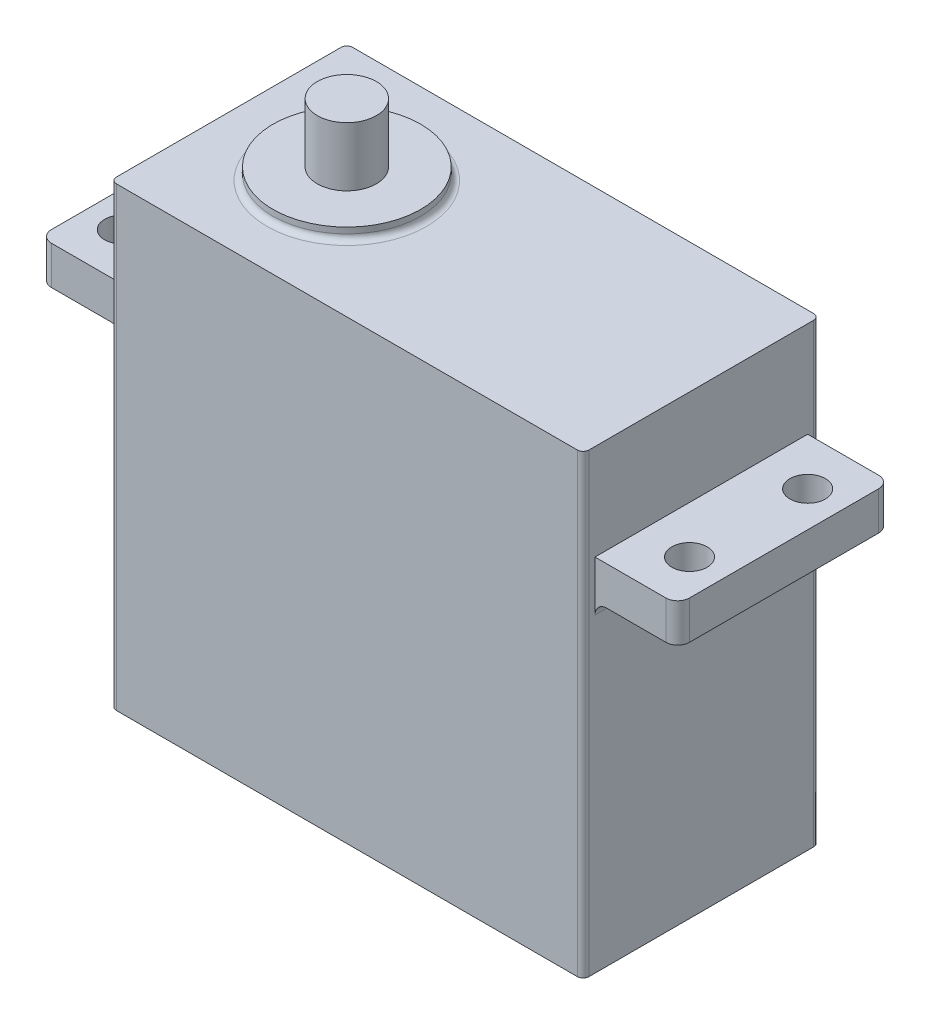
ISO-10303-21;
HEADER;
FILE_DESCRIPTION(('STEP AP214'),'2;1');
FILE_NAME('part.step','',(''),(''),'','','');
FILE_SCHEMA(('AUTOMOTIVE_DESIGN { 1 0 10303 214 1 1 1 1 }'));
ENDSEC;
DATA;
#1=APPLICATION_CONTEXT('core data for automotive mechanical design processes');
#2=APPLICATION_PROTOCOL_DEFINITION('international standard','automotive_design',2000,#1);
#3=PRODUCT_CONTEXT('',#1,'mechanical');
#4=PRODUCT('Part','Part','',(#3));
#5=PRODUCT_RELATED_PRODUCT_CATEGORY('part','',(#4));
#6=PRODUCT_DEFINITION_FORMATION('','',#4);
#7=PRODUCT_DEFINITION_CONTEXT('part definition',#1,'design');
#8=PRODUCT_DEFINITION('design','',#6,#7);
#9=PRODUCT_DEFINITION_SHAPE('','',#8);
#10=(LENGTH_UNIT() NAMED_UNIT(*) SI_UNIT(.MILLI.,.METRE.));
#11=(NAMED_UNIT(*) PLANE_ANGLE_UNIT() SI_UNIT($,.RADIAN.));
#12=(NAMED_UNIT(*) SI_UNIT($,.STERADIAN.) SOLID_ANGLE_UNIT());
#13=UNCERTAINTY_MEASURE_WITH_UNIT(LENGTH_MEASURE(1.E-05),#10,'distance_accuracy_value','');
#14=(GEOMETRIC_REPRESENTATION_CONTEXT(3) GLOBAL_UNCERTAINTY_ASSIGNED_CONTEXT((#13)) GLOBAL_UNIT_ASSIGNED_CONTEXT((#10,
#11,#12)) REPRESENTATION_CONTEXT('',''));
#15=CARTESIAN_POINT('',(0.,0.,0.));
#16=DIRECTION('',(0.,0.,1.));
#17=DIRECTION('',(1.,0.,0.));
#18=AXIS2_PLACEMENT_3D('',#15,#16,#17);
#19=CARTESIAN_POINT('',(-10.,44.6,0.));
#20=DIRECTION('',(0.,1.,0.));
#21=DIRECTION('',(0.,0.,1.));
#22=AXIS2_PLACEMENT_3D('',#19,#20,#21);
#23=PLANE('',#22);
#24=CARTESIAN_POINT('',(-10.,44.6,0.));
#25=DIRECTION('',(0.,-1.,0.));
#26=DIRECTION('',(0.,0.,-1.));
#27=AXIS2_PLACEMENT_3D('',#24,#25,#26);
#28=CIRCLE('',#27,2.5);
#29=CARTESIAN_POINT('',(-10.,44.6,-2.5));
#30=VERTEX_POINT('',#29);
#31=EDGE_CURVE('E193',#30,#30,#28,.T.);
#32=ORIENTED_EDGE('',*,*,#31,.F.);
#33=EDGE_LOOP('',(#32));
#34=FACE_BOUND('',#33,.T.);
#35=ADVANCED_FACE('F17',(#34),#23,.T.);
#36=CARTESIAN_POINT('',(-10.,44.6,0.));
#37=DIRECTION('',(0.,-1.,0.));
#38=DIRECTION('',(0.,0.,-1.));
#39=AXIS2_PLACEMENT_3D('',#36,#37,#38);
#40=CYLINDRICAL_SURFACE('',#39,2.5);
#41=CARTESIAN_POINT('',(-10.,39.6,0.));
#42=DIRECTION('',(0.,-1.,0.));
#43=DIRECTION('',(0.,0.,-1.));
#44=AXIS2_PLACEMENT_3D('',#41,#42,#43);
#45=CIRCLE('',#44,2.5);
#46=CARTESIAN_POINT('',(-10.,39.6,-2.5));
#47=VERTEX_POINT('',#46);
#48=EDGE_CURVE('E176',#47,#47,#45,.T.);
#49=ORIENTED_EDGE('',*,*,#48,.F.);
#50=EDGE_LOOP('',(#49));
#51=FACE_BOUND('',#50,.T.);
#52=ORIENTED_EDGE('',*,*,#31,.T.);
#53=EDGE_LOOP('',(#52));
#54=FACE_BOUND('',#53,.T.);
#55=ADVANCED_FACE('F600',(#51,#54),#40,.T.);
#56=CARTESIAN_POINT('',(-10.,39.6,0.));
#57=DIRECTION('',(0.,1.,0.));
#58=DIRECTION('',(0.,0.,1.));
#59=AXIS2_PLACEMENT_3D('',#56,#57,#58);
#60=PLANE('',#59);
#61=CARTESIAN_POINT('',(-10.,39.6,0.));
#62=DIRECTION('',(0.,-1.,0.));
#63=DIRECTION('',(0.,0.,-1.));
#64=AXIS2_PLACEMENT_3D('',#61,#62,#63);
#65=CIRCLE('',#64,6.25);
#66=CARTESIAN_POINT('',(-10.,39.6,-6.25));
#67=VERTEX_POINT('',#66);
#68=EDGE_CURVE('E276',#67,#67,#65,.T.);
#69=ORIENTED_EDGE('',*,*,#68,.F.);
#70=EDGE_LOOP('',(#69));
#71=FACE_BOUND('',#70,.T.);
#72=ORIENTED_EDGE('',*,*,#48,.T.);
#73=EDGE_LOOP('',(#72));
#74=FACE_BOUND('',#73,.T.);
#75=ADVANCED_FACE('F597',(#71,#74),#60,.T.);
#76=CARTESIAN_POINT('',(24.,30.5,5.));
#77=DIRECTION('',(0.,-1.,0.));
#78=DIRECTION('',(0.,0.,-1.));
#79=AXIS2_PLACEMENT_3D('',#76,#77,#78);
#80=CYLINDRICAL_SURFACE('',#79,1.5);
#81=CARTESIAN_POINT('',(24.,27.25,5.));
#82=DIRECTION('',(0.,-1.,0.));
#83=DIRECTION('',(0.,0.,-1.));
#84=AXIS2_PLACEMENT_3D('',#81,#82,#83);
#85=CIRCLE('',#84,1.5);
#86=CARTESIAN_POINT('',(24.,27.25,3.5));
#87=VERTEX_POINT('',#86);
#88=EDGE_CURVE('E167',#87,#87,#85,.F.);
#89=ORIENTED_EDGE('',*,*,#88,.F.);
#90=EDGE_LOOP('',(#89));
#91=FACE_BOUND('',#90,.T.);
#92=CARTESIAN_POINT('',(24.,30.5,5.));
#93=DIRECTION('',(0.,-1.,0.));
#94=DIRECTION('',(0.,0.,-1.));
#95=AXIS2_PLACEMENT_3D('',#92,#93,#94);
#96=CIRCLE('',#95,1.5);
#97=CARTESIAN_POINT('',(24.,30.5,3.5));
#98=VERTEX_POINT('',#97);
#99=EDGE_CURVE('E273',#98,#98,#96,.F.);
#100=ORIENTED_EDGE('',*,*,#99,.T.);
#101=EDGE_LOOP('',(#100));
#102=FACE_BOUND('',#101,.T.);
#103=ADVANCED_FACE('F593',(#91,#102),#80,.F.);
#104=CARTESIAN_POINT('',(24.,30.5,-5.));
#105=DIRECTION('',(0.,-1.,0.));
#106=DIRECTION('',(0.,0.,-1.));
#107=AXIS2_PLACEMENT_3D('',#104,#105,#106);
#108=CYLINDRICAL_SURFACE('',#107,1.5);
#109=CARTESIAN_POINT('',(24.,27.25,-5.));
#110=DIRECTION('',(0.,-1.,0.));
#111=DIRECTION('',(0.,0.,-1.));
#112=AXIS2_PLACEMENT_3D('',#109,#110,#111);
#113=CIRCLE('',#112,1.5);
#114=CARTESIAN_POINT('',(24.,27.25,-6.5));
#115=VERTEX_POINT('',#114);
#116=EDGE_CURVE('E182',#115,#115,#113,.F.);
#117=ORIENTED_EDGE('',*,*,#116,.F.);
#118=EDGE_LOOP('',(#117));
#119=FACE_BOUND('',#118,.T.);
#120=CARTESIAN_POINT('',(24.,30.5,-5.));
#121=DIRECTION('',(0.,-1.,0.));
#122=DIRECTION('',(0.,0.,-1.));
#123=AXIS2_PLACEMENT_3D('',#120,#121,#122);
#124=CIRCLE('',#123,1.5);
#125=CARTESIAN_POINT('',(24.,30.5,-6.5));
#126=VERTEX_POINT('',#125);
#127=EDGE_CURVE('E270',#126,#126,#124,.F.);
#128=ORIENTED_EDGE('',*,*,#127,.T.);
#129=EDGE_LOOP('',(#128));
#130=FACE_BOUND('',#129,.T.);
#131=ADVANCED_FACE('F590',(#119,#130),#108,.F.);
#132=CARTESIAN_POINT('',(27.,30.5,9.));
#133=DIRECTION('',(-1.,0.,0.));
#134=DIRECTION('',(0.,0.,1.));
#135=AXIS2_PLACEMENT_3D('',#132,#133,#134);
#136=PLANE('',#135);
#137=DIRECTION('',(0.,-1.,0.));
#138=VECTOR('',#137,1.);
#139=CARTESIAN_POINT('',(27.,30.5,-8.));
#140=LINE('',#139,#138);
#141=CARTESIAN_POINT('',(27.,30.5,-8.));
#142=VERTEX_POINT('',#141);
#143=CARTESIAN_POINT('',(27.,27.25,-8.));
#144=VERTEX_POINT('',#143);
#145=EDGE_CURVE('E185',#142,#144,#140,.T.);
#146=ORIENTED_EDGE('',*,*,#145,.F.);
#147=DIRECTION('',(0.,0.,-1.));
#148=VECTOR('',#147,1.);
#149=CARTESIAN_POINT('',(27.,30.5,0.));
#150=LINE('',#149,#148);
#151=CARTESIAN_POINT('',(27.,30.5,8.));
#152=VERTEX_POINT('',#151);
#153=EDGE_CURVE('E173',#142,#152,#150,.F.);
#154=ORIENTED_EDGE('',*,*,#153,.T.);
#155=DIRECTION('',(0.,-1.,0.));
#156=VECTOR('',#155,1.);
#157=CARTESIAN_POINT('',(27.,30.5,8.));
#158=LINE('',#157,#156);
#159=CARTESIAN_POINT('',(27.,27.25,8.));
#160=VERTEX_POINT('',#159);
#161=EDGE_CURVE('E170',#160,#152,#158,.F.);
#162=ORIENTED_EDGE('',*,*,#161,.F.);
#163=DIRECTION('',(0.,0.,-1.));
#164=VECTOR('',#163,1.);
#165=CARTESIAN_POINT('',(27.,27.25,0.));
#166=LINE('',#165,#164);
#167=EDGE_CURVE('E156',#144,#160,#166,.F.);
#168=ORIENTED_EDGE('',*,*,#167,.F.);
#169=EDGE_LOOP('',(#146,#154,#162,#168));
#170=FACE_BOUND('',#169,.T.);
#171=ADVANCED_FACE('F171',(#170),#136,.F.);
#172=CARTESIAN_POINT('',(26.,30.5,8.));
#173=DIRECTION('',(0.,-1.,0.));
#174=DIRECTION('',(0.,0.,-1.));
#175=AXIS2_PLACEMENT_3D('',#172,#173,#174);
#176=CYLINDRICAL_SURFACE('',#175,1.);
#177=CARTESIAN_POINT('',(26.,27.25,8.));
#178=DIRECTION('',(0.,-1.,0.));
#179=DIRECTION('',(0.,0.,-1.));
#180=AXIS2_PLACEMENT_3D('',#177,#178,#179);
#181=CIRCLE('',#180,1.);
#182=CARTESIAN_POINT('',(26.,27.25,9.));
#183=VERTEX_POINT('',#182);
#184=EDGE_CURVE('E162',#160,#183,#181,.T.);
#185=ORIENTED_EDGE('',*,*,#184,.F.);
#186=ORIENTED_EDGE('',*,*,#161,.T.);
#187=CARTESIAN_POINT('',(26.,30.5,8.));
#188=DIRECTION('',(0.,-1.,0.));
#189=DIRECTION('',(0.,0.,-1.));
#190=AXIS2_PLACEMENT_3D('',#187,#188,#189);
#191=CIRCLE('',#190,1.);
#192=CARTESIAN_POINT('',(26.,30.5,9.));
#193=VERTEX_POINT('',#192);
#194=EDGE_CURVE('E268',#152,#193,#191,.T.);
#195=ORIENTED_EDGE('',*,*,#194,.T.);
#196=DIRECTION('',(0.,1.,0.));
#197=VECTOR('',#196,1.);
#198=CARTESIAN_POINT('',(26.,30.5,9.));
#199=LINE('',#198,#197);
#200=EDGE_CURVE('E181',#193,#183,#199,.F.);
#201=ORIENTED_EDGE('',*,*,#200,.T.);
#202=EDGE_LOOP('',(#185,#186,#195,#201));
#203=FACE_BOUND('',#202,.T.);
#204=ADVANCED_FACE('F179',(#203),#176,.T.);
#205=CARTESIAN_POINT('',(0.,27.25,0.));
#206=DIRECTION('',(0.,-1.,0.));
#207=DIRECTION('',(0.,0.,-1.));
#208=AXIS2_PLACEMENT_3D('',#205,#206,#207);
#209=PLANE('',#208);
#210=ORIENTED_EDGE('',*,*,#116,.T.);
#211=EDGE_LOOP('',(#210));
#212=FACE_BOUND('',#211,.T.);
#213=DIRECTION('',(-1.,0.,0.));
#214=VECTOR('',#213,1.);
#215=CARTESIAN_POINT('',(27.,27.25,9.));
#216=LINE('',#215,#214);
#217=CARTESIAN_POINT('',(21.,27.25,9.));
#218=VERTEX_POINT('',#217);
#219=EDGE_CURVE('E418',#183,#218,#216,.T.);
#220=ORIENTED_EDGE('',*,*,#219,.T.);
#221=DIRECTION('',(0.,0.,-1.));
#222=VECTOR('',#221,1.);
#223=CARTESIAN_POINT('',(21.,27.25,0.));
#224=LINE('',#223,#222);
#225=CARTESIAN_POINT('',(21.,27.25,-9.));
#226=VERTEX_POINT('',#225);
#227=EDGE_CURVE('E264',#218,#226,#224,.T.);
#228=ORIENTED_EDGE('',*,*,#227,.T.);
#229=DIRECTION('',(1.,0.,0.));
#230=VECTOR('',#229,1.);
#231=CARTESIAN_POINT('',(27.,27.25,-9.));
#232=LINE('',#231,#230);
#233=CARTESIAN_POINT('',(26.,27.25,-9.));
#234=VERTEX_POINT('',#233);
#235=EDGE_CURVE('E260',#226,#234,#232,.T.);
#236=ORIENTED_EDGE('',*,*,#235,.T.);
#237=CARTESIAN_POINT('',(26.,27.25,-8.));
#238=DIRECTION('',(0.,-1.,0.));
#239=DIRECTION('',(0.,0.,-1.));
#240=AXIS2_PLACEMENT_3D('',#237,#238,#239);
#241=CIRCLE('',#240,1.);
#242=EDGE_CURVE('E165',#144,#234,#241,.F.);
#243=ORIENTED_EDGE('',*,*,#242,.F.);
#244=ORIENTED_EDGE('',*,*,#167,.T.);
#245=ORIENTED_EDGE('',*,*,#184,.T.);
#246=EDGE_LOOP('',(#220,#228,#236,#243,#244,#245));
#247=FACE_BOUND('',#246,.T.);
#248=ORIENTED_EDGE('',*,*,#88,.T.);
#249=EDGE_LOOP('',(#248));
#250=FACE_BOUND('',#249,.T.);
#251=ADVANCED_FACE('F159',(#212,#247,#250),#209,.T.);
#252=CARTESIAN_POINT('',(26.,30.5,-8.));
#253=DIRECTION('',(0.,-1.,0.));
#254=DIRECTION('',(0.,0.,-1.));
#255=AXIS2_PLACEMENT_3D('',#252,#253,#254);
#256=CYLINDRICAL_SURFACE('',#255,1.);
#257=ORIENTED_EDGE('',*,*,#242,.T.);
#258=DIRECTION('',(0.,1.,0.));
#259=VECTOR('',#258,1.);
#260=CARTESIAN_POINT('',(26.,30.5,-9.));
#261=LINE('',#260,#259);
#262=CARTESIAN_POINT('',(26.,30.5,-9.));
#263=VERTEX_POINT('',#262);
#264=EDGE_CURVE('E396',#234,#263,#261,.T.);
#265=ORIENTED_EDGE('',*,*,#264,.T.);
#266=CARTESIAN_POINT('',(26.,30.5,-8.));
#267=DIRECTION('',(0.,-1.,0.));
#268=DIRECTION('',(0.,0.,-1.));
#269=AXIS2_PLACEMENT_3D('',#266,#267,#268);
#270=CIRCLE('',#269,1.);
#271=EDGE_CURVE('E265',#263,#142,#270,.T.);
#272=ORIENTED_EDGE('',*,*,#271,.T.);
#273=ORIENTED_EDGE('',*,*,#145,.T.);
#274=EDGE_LOOP('',(#257,#265,#272,#273));
#275=FACE_BOUND('',#274,.T.);
#276=ADVANCED_FACE('F579',(#275),#256,.T.);
#277=CARTESIAN_POINT('',(-24.,30.5,5.));
#278=DIRECTION('',(0.,-1.,0.));
#279=DIRECTION('',(0.,0.,-1.));
#280=AXIS2_PLACEMENT_3D('',#277,#278,#279);
#281=CYLINDRICAL_SURFACE('',#280,1.5);
#282=CARTESIAN_POINT('',(-24.,27.25,5.));
#283=DIRECTION('',(0.,-1.,0.));
#284=DIRECTION('',(0.,0.,-1.));
#285=AXIS2_PLACEMENT_3D('',#282,#283,#284);
#286=CIRCLE('',#285,1.5);
#287=CARTESIAN_POINT('',(-24.,27.25,3.5));
#288=VERTEX_POINT('',#287);
#289=EDGE_CURVE('E288',#288,#288,#286,.F.);
#290=ORIENTED_EDGE('',*,*,#289,.F.);
#291=EDGE_LOOP('',(#290));
#292=FACE_BOUND('',#291,.T.);
#293=CARTESIAN_POINT('',(-24.,30.5,5.));
#294=DIRECTION('',(0.,-1.,0.));
#295=DIRECTION('',(0.,0.,-1.));
#296=AXIS2_PLACEMENT_3D('',#293,#294,#295);
#297=CIRCLE('',#296,1.5);
#298=CARTESIAN_POINT('',(-24.,30.5,3.5));
#299=VERTEX_POINT('',#298);
#300=EDGE_CURVE('E253',#299,#299,#297,.F.);
#301=ORIENTED_EDGE('',*,*,#300,.T.);
#302=EDGE_LOOP('',(#301));
#303=FACE_BOUND('',#302,.T.);
#304=ADVANCED_FACE('F575',(#292,#303),#281,.F.);
#305=CARTESIAN_POINT('',(-24.,30.5,-5.));
#306=DIRECTION('',(0.,-1.,0.));
#307=DIRECTION('',(0.,0.,-1.));
#308=AXIS2_PLACEMENT_3D('',#305,#306,#307);
#309=CYLINDRICAL_SURFACE('',#308,1.5);
#310=CARTESIAN_POINT('',(-24.,27.25,-5.));
#311=DIRECTION('',(0.,-1.,0.));
#312=DIRECTION('',(0.,0.,-1.));
#313=AXIS2_PLACEMENT_3D('',#310,#311,#312);
#314=CIRCLE('',#313,1.5);
#315=CARTESIAN_POINT('',(-24.,27.25,-6.5));
#316=VERTEX_POINT('',#315);
#317=EDGE_CURVE('E285',#316,#316,#314,.F.);
#318=ORIENTED_EDGE('',*,*,#317,.F.);
#319=EDGE_LOOP('',(#318));
#320=FACE_BOUND('',#319,.T.);
#321=CARTESIAN_POINT('',(-24.,30.5,-5.));
#322=DIRECTION('',(0.,-1.,0.));
#323=DIRECTION('',(0.,0.,-1.));
#324=AXIS2_PLACEMENT_3D('',#321,#322,#323);
#325=CIRCLE('',#324,1.5);
#326=CARTESIAN_POINT('',(-24.,30.5,-6.5));
#327=VERTEX_POINT('',#326);
#328=EDGE_CURVE('E250',#327,#327,#325,.F.);
#329=ORIENTED_EDGE('',*,*,#328,.T.);
#330=EDGE_LOOP('',(#329));
#331=FACE_BOUND('',#330,.T.);
#332=ADVANCED_FACE('F571',(#320,#331),#309,.F.);
#333=CARTESIAN_POINT('',(-27.,30.5,9.));
#334=DIRECTION('',(1.,0.,0.));
#335=DIRECTION('',(0.,0.,-1.));
#336=AXIS2_PLACEMENT_3D('',#333,#334,#335);
#337=PLANE('',#336);
#338=DIRECTION('',(0.,-1.,0.));
#339=VECTOR('',#338,1.);
#340=CARTESIAN_POINT('',(-27.,30.5,-8.));
#341=LINE('',#340,#339);
#342=CARTESIAN_POINT('',(-27.,27.25,-8.));
#343=VERTEX_POINT('',#342);
#344=CARTESIAN_POINT('',(-27.,30.5,-8.));
#345=VERTEX_POINT('',#344);
#346=EDGE_CURVE('E290',#343,#345,#341,.F.);
#347=ORIENTED_EDGE('',*,*,#346,.F.);
#348=DIRECTION('',(0.,0.,-1.));
#349=VECTOR('',#348,1.);
#350=CARTESIAN_POINT('',(-27.,27.25,0.));
#351=LINE('',#350,#349);
#352=CARTESIAN_POINT('',(-27.,27.25,8.));
#353=VERTEX_POINT('',#352);
#354=EDGE_CURVE('E284',#353,#343,#351,.T.);
#355=ORIENTED_EDGE('',*,*,#354,.F.);
#356=DIRECTION('',(0.,-1.,0.));
#357=VECTOR('',#356,1.);
#358=CARTESIAN_POINT('',(-27.,30.5,8.));
#359=LINE('',#358,#357);
#360=CARTESIAN_POINT('',(-27.,30.5,8.));
#361=VERTEX_POINT('',#360);
#362=EDGE_CURVE('E281',#361,#353,#359,.T.);
#363=ORIENTED_EDGE('',*,*,#362,.F.);
#364=DIRECTION('',(0.,0.,-1.));
#365=VECTOR('',#364,1.);
#366=CARTESIAN_POINT('',(-27.,30.5,0.));
#367=LINE('',#366,#365);
#368=EDGE_CURVE('E246',#361,#345,#367,.T.);
#369=ORIENTED_EDGE('',*,*,#368,.T.);
#370=EDGE_LOOP('',(#347,#355,#363,#369));
#371=FACE_BOUND('',#370,.T.);
#372=ADVANCED_FACE('F567',(#371),#337,.F.);
#373=CARTESIAN_POINT('',(-26.,30.5,-8.));
#374=DIRECTION('',(0.,-1.,0.));
#375=DIRECTION('',(0.,0.,-1.));
#376=AXIS2_PLACEMENT_3D('',#373,#374,#375);
#377=CYLINDRICAL_SURFACE('',#376,0.999999999999999);
#378=CARTESIAN_POINT('',(-26.,27.25,-8.));
#379=DIRECTION('',(0.,-1.,0.));
#380=DIRECTION('',(0.,0.,-1.));
#381=AXIS2_PLACEMENT_3D('',#378,#379,#380);
#382=CIRCLE('',#381,0.999999999999999);
#383=CARTESIAN_POINT('',(-26.,27.25,-9.));
#384=VERTEX_POINT('',#383);
#385=EDGE_CURVE('E282',#343,#384,#382,.T.);
#386=ORIENTED_EDGE('',*,*,#385,.F.);
#387=ORIENTED_EDGE('',*,*,#346,.T.);
#388=CARTESIAN_POINT('',(-26.,30.5,-8.));
#389=DIRECTION('',(0.,-1.,0.));
#390=DIRECTION('',(0.,0.,-1.));
#391=AXIS2_PLACEMENT_3D('',#388,#389,#390);
#392=CIRCLE('',#391,0.999999999999999);
#393=CARTESIAN_POINT('',(-26.,30.5,-9.));
#394=VERTEX_POINT('',#393);
#395=EDGE_CURVE('E243',#345,#394,#392,.T.);
#396=ORIENTED_EDGE('',*,*,#395,.T.);
#397=DIRECTION('',(0.,1.,0.));
#398=VECTOR('',#397,1.);
#399=CARTESIAN_POINT('',(-26.,30.5,-9.));
#400=LINE('',#399,#398);
#401=EDGE_CURVE('E388',#394,#384,#400,.F.);
#402=ORIENTED_EDGE('',*,*,#401,.T.);
#403=EDGE_LOOP('',(#386,#387,#396,#402));
#404=FACE_BOUND('',#403,.T.);
#405=ADVANCED_FACE('F563',(#404),#377,.T.);
#406=CARTESIAN_POINT('',(0.,27.25,0.));
#407=DIRECTION('',(0.,-1.,0.));
#408=DIRECTION('',(0.,0.,-1.));
#409=AXIS2_PLACEMENT_3D('',#406,#407,#408);
#410=PLANE('',#409);
#411=ORIENTED_EDGE('',*,*,#354,.T.);
#412=ORIENTED_EDGE('',*,*,#385,.T.);
#413=DIRECTION('',(1.,0.,0.));
#414=VECTOR('',#413,1.);
#415=CARTESIAN_POINT('',(-27.,27.25,-9.));
#416=LINE('',#415,#414);
#417=CARTESIAN_POINT('',(-21.,27.25,-9.));
#418=VERTEX_POINT('',#417);
#419=EDGE_CURVE('E385',#384,#418,#416,.T.);
#420=ORIENTED_EDGE('',*,*,#419,.T.);
#421=DIRECTION('',(0.,0.,1.));
#422=VECTOR('',#421,1.);
#423=CARTESIAN_POINT('',(-21.,27.25,0.));
#424=LINE('',#423,#422);
#425=CARTESIAN_POINT('',(-21.,27.25,9.));
#426=VERTEX_POINT('',#425);
#427=EDGE_CURVE('E242',#418,#426,#424,.T.);
#428=ORIENTED_EDGE('',*,*,#427,.T.);
#429=DIRECTION('',(-1.,0.,0.));
#430=VECTOR('',#429,1.);
#431=CARTESIAN_POINT('',(-27.,27.25,9.));
#432=LINE('',#431,#430);
#433=CARTESIAN_POINT('',(-26.,27.25,9.));
#434=VERTEX_POINT('',#433);
#435=EDGE_CURVE('E238',#426,#434,#432,.T.);
#436=ORIENTED_EDGE('',*,*,#435,.T.);
#437=CARTESIAN_POINT('',(-26.,27.25,8.));
#438=DIRECTION('',(0.,-1.,0.));
#439=DIRECTION('',(0.,0.,-1.));
#440=AXIS2_PLACEMENT_3D('',#437,#438,#439);
#441=CIRCLE('',#440,1.);
#442=EDGE_CURVE('E279',#353,#434,#441,.F.);
#443=ORIENTED_EDGE('',*,*,#442,.F.);
#444=EDGE_LOOP('',(#411,#412,#420,#428,#436,#443));
#445=FACE_BOUND('',#444,.T.);
#446=ORIENTED_EDGE('',*,*,#317,.T.);
#447=EDGE_LOOP('',(#446));
#448=FACE_BOUND('',#447,.T.);
#449=ORIENTED_EDGE('',*,*,#289,.T.);
#450=EDGE_LOOP('',(#449));
#451=FACE_BOUND('',#450,.T.);
#452=ADVANCED_FACE('F559',(#445,#448,#451),#410,.T.);
#453=CARTESIAN_POINT('',(-26.,30.5,8.));
#454=DIRECTION('',(0.,-1.,0.));
#455=DIRECTION('',(0.,0.,-1.));
#456=AXIS2_PLACEMENT_3D('',#453,#454,#455);
#457=CYLINDRICAL_SURFACE('',#456,1.);
#458=ORIENTED_EDGE('',*,*,#442,.T.);
#459=DIRECTION('',(0.,1.,0.));
#460=VECTOR('',#459,1.);
#461=CARTESIAN_POINT('',(-26.,30.5,9.));
#462=LINE('',#461,#460);
#463=CARTESIAN_POINT('',(-26.,30.5,9.));
#464=VERTEX_POINT('',#463);
#465=EDGE_CURVE('E364',#434,#464,#462,.T.);
#466=ORIENTED_EDGE('',*,*,#465,.T.);
#467=CARTESIAN_POINT('',(-26.,30.5,8.));
#468=DIRECTION('',(0.,-1.,0.));
#469=DIRECTION('',(0.,0.,-1.));
#470=AXIS2_PLACEMENT_3D('',#467,#468,#469);
#471=CIRCLE('',#470,1.);
#472=EDGE_CURVE('E247',#464,#361,#471,.T.);
#473=ORIENTED_EDGE('',*,*,#472,.T.);
#474=ORIENTED_EDGE('',*,*,#362,.T.);
#475=EDGE_LOOP('',(#458,#466,#473,#474));
#476=FACE_BOUND('',#475,.T.);
#477=ADVANCED_FACE('F555',(#476),#457,.T.);
#478=CARTESIAN_POINT('',(-10.,39.6,0.));
#479=DIRECTION('',(0.,-1.,0.));
#480=DIRECTION('',(0.,0.,-1.));
#481=AXIS2_PLACEMENT_3D('',#478,#479,#480);
#482=CYLINDRICAL_SURFACE('',#481,6.25);
#483=CARTESIAN_POINT('',(-10.,39.1,0.));
#484=DIRECTION('',(0.,1.,0.));
#485=DIRECTION('',(0.,0.,1.));
#486=AXIS2_PLACEMENT_3D('',#483,#484,#485);
#487=CIRCLE('',#486,6.25);
#488=CARTESIAN_POINT('',(-10.,39.1,6.25));
#489=VERTEX_POINT('',#488);
#490=EDGE_CURVE('E227',#489,#489,#487,.T.);
#491=ORIENTED_EDGE('',*,*,#490,.T.);
#492=EDGE_LOOP('',(#491));
#493=FACE_BOUND('',#492,.T.);
#494=ORIENTED_EDGE('',*,*,#68,.T.);
#495=EDGE_LOOP('',(#494));
#496=FACE_BOUND('',#495,.T.);
#497=ADVANCED_FACE('F552',(#493,#496),#482,.T.);
#498=CARTESIAN_POINT('',(0.,30.5,0.));
#499=DIRECTION('',(0.,-1.,0.));
#500=DIRECTION('',(0.,0.,-1.));
#501=AXIS2_PLACEMENT_3D('',#498,#499,#500);
#502=PLANE('',#501);
#503=ORIENTED_EDGE('',*,*,#271,.F.);
#504=DIRECTION('',(1.,0.,0.));
#505=VECTOR('',#504,1.);
#506=CARTESIAN_POINT('',(27.,30.5,-9.));
#507=LINE('',#506,#505);
#508=CARTESIAN_POINT('',(20.,30.5,-9.));
#509=VERTEX_POINT('',#508);
#510=EDGE_CURVE('E256',#263,#509,#507,.F.);
#511=ORIENTED_EDGE('',*,*,#510,.T.);
#512=DIRECTION('',(0.,0.,1.));
#513=VECTOR('',#512,1.);
#514=CARTESIAN_POINT('',(20.,30.5,10.));
#515=LINE('',#514,#513);
#516=CARTESIAN_POINT('',(20.,30.5,9.));
#517=VERTEX_POINT('',#516);
#518=EDGE_CURVE('E409',#509,#517,#515,.T.);
#519=ORIENTED_EDGE('',*,*,#518,.T.);
#520=DIRECTION('',(-1.,0.,0.));
#521=VECTOR('',#520,1.);
#522=CARTESIAN_POINT('',(27.,30.5,9.));
#523=LINE('',#522,#521);
#524=EDGE_CURVE('E420',#517,#193,#523,.F.);
#525=ORIENTED_EDGE('',*,*,#524,.T.);
#526=ORIENTED_EDGE('',*,*,#194,.F.);
#527=ORIENTED_EDGE('',*,*,#153,.F.);
#528=EDGE_LOOP('',(#503,#511,#519,#525,#526,#527));
#529=FACE_BOUND('',#528,.T.);
#530=ORIENTED_EDGE('',*,*,#127,.F.);
#531=EDGE_LOOP('',(#530));
#532=FACE_BOUND('',#531,.T.);
#533=ORIENTED_EDGE('',*,*,#99,.F.);
#534=EDGE_LOOP('',(#533));
#535=FACE_BOUND('',#534,.T.);
#536=ADVANCED_FACE('F451',(#529,#532,#535),#502,.F.);
#537=CARTESIAN_POINT('',(27.,30.5,9.));
#538=DIRECTION('',(0.,0.,-1.));
#539=DIRECTION('',(-1.,0.,0.));
#540=AXIS2_PLACEMENT_3D('',#537,#538,#539);
#541=PLANE('',#540);
#542=ORIENTED_EDGE('',*,*,#200,.F.);
#543=ORIENTED_EDGE('',*,*,#524,.F.);
#544=DIRECTION('',(0.,1.,0.));
#545=VECTOR('',#544,1.);
#546=CARTESIAN_POINT('',(20.,27.25,9.));
#547=LINE('',#546,#545);
#548=CARTESIAN_POINT('',(20.,26.25,9.));
#549=VERTEX_POINT('',#548);
#550=EDGE_CURVE('E400',#517,#549,#547,.F.);
#551=ORIENTED_EDGE('',*,*,#550,.T.);
#552=CARTESIAN_POINT('',(21.,26.25,9.));
#553=DIRECTION('',(0.,0.,-1.));
#554=DIRECTION('',(-1.,0.,0.));
#555=AXIS2_PLACEMENT_3D('',#552,#553,#554);
#556=CIRCLE('',#555,1.);
#557=EDGE_CURVE('E261',#549,#218,#556,.T.);
#558=ORIENTED_EDGE('',*,*,#557,.T.);
#559=ORIENTED_EDGE('',*,*,#219,.F.);
#560=EDGE_LOOP('',(#542,#543,#551,#558,#559));
#561=FACE_BOUND('',#560,.T.);
#562=ADVANCED_FACE('F448',(#561),#541,.F.);
#563=CARTESIAN_POINT('',(21.,26.25,0.));
#564=DIRECTION('',(0.,0.,-1.));
#565=DIRECTION('',(-1.,0.,0.));
#566=AXIS2_PLACEMENT_3D('',#563,#564,#565);
#567=CYLINDRICAL_SURFACE('',#566,1.);
#568=DIRECTION('',(0.,0.,1.));
#569=VECTOR('',#568,1.);
#570=CARTESIAN_POINT('',(20.,26.25,10.));
#571=LINE('',#570,#569);
#572=CARTESIAN_POINT('',(20.,26.25,-9.));
#573=VERTEX_POINT('',#572);
#574=EDGE_CURVE('E397',#549,#573,#571,.F.);
#575=ORIENTED_EDGE('',*,*,#574,.T.);
#576=CARTESIAN_POINT('',(21.,26.25,-9.));
#577=DIRECTION('',(0.,0.,-1.));
#578=DIRECTION('',(-1.,0.,0.));
#579=AXIS2_PLACEMENT_3D('',#576,#577,#578);
#580=CIRCLE('',#579,1.);
#581=EDGE_CURVE('E257',#573,#226,#580,.T.);
#582=ORIENTED_EDGE('',*,*,#581,.T.);
#583=ORIENTED_EDGE('',*,*,#227,.F.);
#584=ORIENTED_EDGE('',*,*,#557,.F.);
#585=EDGE_LOOP('',(#575,#582,#583,#584));
#586=FACE_BOUND('',#585,.T.);
#587=ADVANCED_FACE('F441',(#586),#567,.F.);
#588=CARTESIAN_POINT('',(27.,30.5,-9.));
#589=DIRECTION('',(0.,0.,1.));
#590=DIRECTION('',(1.,0.,0.));
#591=AXIS2_PLACEMENT_3D('',#588,#589,#590);
#592=PLANE('',#591);
#593=ORIENTED_EDGE('',*,*,#264,.F.);
#594=ORIENTED_EDGE('',*,*,#235,.F.);
#595=ORIENTED_EDGE('',*,*,#581,.F.);
#596=DIRECTION('',(0.,1.,0.));
#597=VECTOR('',#596,1.);
#598=CARTESIAN_POINT('',(20.,27.25,-9.));
#599=LINE('',#598,#597);
#600=EDGE_CURVE('E341',#573,#509,#599,.T.);
#601=ORIENTED_EDGE('',*,*,#600,.T.);
#602=ORIENTED_EDGE('',*,*,#510,.F.);
#603=EDGE_LOOP('',(#593,#594,#595,#601,#602));
#604=FACE_BOUND('',#603,.T.);
#605=ADVANCED_FACE('F438',(#604),#592,.F.);
#606=CARTESIAN_POINT('',(0.,30.5,0.));
#607=DIRECTION('',(0.,-1.,0.));
#608=DIRECTION('',(0.,0.,-1.));
#609=AXIS2_PLACEMENT_3D('',#606,#607,#608);
#610=PLANE('',#609);
#611=ORIENTED_EDGE('',*,*,#395,.F.);
#612=ORIENTED_EDGE('',*,*,#368,.F.);
#613=ORIENTED_EDGE('',*,*,#472,.F.);
#614=DIRECTION('',(-1.,0.,0.));
#615=VECTOR('',#614,1.);
#616=CARTESIAN_POINT('',(-27.,30.5,9.));
#617=LINE('',#616,#615);
#618=CARTESIAN_POINT('',(-20.,30.5,9.));
#619=VERTEX_POINT('',#618);
#620=EDGE_CURVE('E234',#464,#619,#617,.F.);
#621=ORIENTED_EDGE('',*,*,#620,.T.);
#622=DIRECTION('',(0.,0.,-1.));
#623=VECTOR('',#622,1.);
#624=CARTESIAN_POINT('',(-20.,30.5,-10.));
#625=LINE('',#624,#623);
#626=CARTESIAN_POINT('',(-20.,30.5,-9.));
#627=VERTEX_POINT('',#626);
#628=EDGE_CURVE('E340',#619,#627,#625,.T.);
#629=ORIENTED_EDGE('',*,*,#628,.T.);
#630=DIRECTION('',(1.,0.,0.));
#631=VECTOR('',#630,1.);
#632=CARTESIAN_POINT('',(-27.,30.5,-9.));
#633=LINE('',#632,#631);
#634=EDGE_CURVE('E245',#627,#394,#633,.F.);
#635=ORIENTED_EDGE('',*,*,#634,.T.);
#636=EDGE_LOOP('',(#611,#612,#613,#621,#629,#635));
#637=FACE_BOUND('',#636,.T.);
#638=ORIENTED_EDGE('',*,*,#328,.F.);
#639=EDGE_LOOP('',(#638));
#640=FACE_BOUND('',#639,.T.);
#641=ORIENTED_EDGE('',*,*,#300,.F.);
#642=EDGE_LOOP('',(#641));
#643=FACE_BOUND('',#642,.T.);
#644=ADVANCED_FACE('F539',(#637,#640,#643),#610,.F.);
#645=CARTESIAN_POINT('',(-27.,30.5,-9.));
#646=DIRECTION('',(0.,0.,1.));
#647=DIRECTION('',(1.,0.,0.));
#648=AXIS2_PLACEMENT_3D('',#645,#646,#647);
#649=PLANE('',#648);
#650=ORIENTED_EDGE('',*,*,#401,.F.);
#651=ORIENTED_EDGE('',*,*,#634,.F.);
#652=DIRECTION('',(0.,1.,0.));
#653=VECTOR('',#652,1.);
#654=CARTESIAN_POINT('',(-20.,27.25,-9.));
#655=LINE('',#654,#653);
#656=CARTESIAN_POINT('',(-20.,26.25,-9.));
#657=VERTEX_POINT('',#656);
#658=EDGE_CURVE('E368',#627,#657,#655,.F.);
#659=ORIENTED_EDGE('',*,*,#658,.T.);
#660=CARTESIAN_POINT('',(-21.,26.25,-9.));
#661=DIRECTION('',(0.,0.,1.));
#662=DIRECTION('',(1.,0.,0.));
#663=AXIS2_PLACEMENT_3D('',#660,#661,#662);
#664=CIRCLE('',#663,1.);
#665=EDGE_CURVE('E239',#657,#418,#664,.T.);
#666=ORIENTED_EDGE('',*,*,#665,.T.);
#667=ORIENTED_EDGE('',*,*,#419,.F.);
#668=EDGE_LOOP('',(#650,#651,#659,#666,#667));
#669=FACE_BOUND('',#668,.T.);
#670=ADVANCED_FACE('F535',(#669),#649,.F.);
#671=CARTESIAN_POINT('',(-21.,26.25,0.));
#672=DIRECTION('',(0.,0.,1.));
#673=DIRECTION('',(1.,0.,0.));
#674=AXIS2_PLACEMENT_3D('',#671,#672,#673);
#675=CYLINDRICAL_SURFACE('',#674,1.);
#676=DIRECTION('',(0.,0.,-1.));
#677=VECTOR('',#676,1.);
#678=CARTESIAN_POINT('',(-20.,26.25,-10.));
#679=LINE('',#678,#677);
#680=CARTESIAN_POINT('',(-20.,26.25,9.));
#681=VERTEX_POINT('',#680);
#682=EDGE_CURVE('E365',#657,#681,#679,.F.);
#683=ORIENTED_EDGE('',*,*,#682,.T.);
#684=CARTESIAN_POINT('',(-21.,26.25,9.));
#685=DIRECTION('',(0.,0.,1.));
#686=DIRECTION('',(1.,0.,0.));
#687=AXIS2_PLACEMENT_3D('',#684,#685,#686);
#688=CIRCLE('',#687,1.);
#689=EDGE_CURVE('E235',#681,#426,#688,.T.);
#690=ORIENTED_EDGE('',*,*,#689,.T.);
#691=ORIENTED_EDGE('',*,*,#427,.F.);
#692=ORIENTED_EDGE('',*,*,#665,.F.);
#693=EDGE_LOOP('',(#683,#690,#691,#692));
#694=FACE_BOUND('',#693,.T.);
#695=ADVANCED_FACE('F529',(#694),#675,.F.);
#696=CARTESIAN_POINT('',(-27.,30.5,9.));
#697=DIRECTION('',(0.,0.,-1.));
#698=DIRECTION('',(-1.,0.,0.));
#699=AXIS2_PLACEMENT_3D('',#696,#697,#698);
#700=PLANE('',#699);
#701=ORIENTED_EDGE('',*,*,#465,.F.);
#702=ORIENTED_EDGE('',*,*,#435,.F.);
#703=ORIENTED_EDGE('',*,*,#689,.F.);
#704=DIRECTION('',(0.,1.,0.));
#705=VECTOR('',#704,1.);
#706=CARTESIAN_POINT('',(-20.,27.25,9.));
#707=LINE('',#706,#705);
#708=EDGE_CURVE('E334',#681,#619,#707,.T.);
#709=ORIENTED_EDGE('',*,*,#708,.T.);
#710=ORIENTED_EDGE('',*,*,#620,.F.);
#711=EDGE_LOOP('',(#701,#702,#703,#709,#710));
#712=FACE_BOUND('',#711,.T.);
#713=ADVANCED_FACE('F524',(#712),#700,.F.);
#714=CARTESIAN_POINT('',(19.5,27.25,9.5));
#715=DIRECTION('',(0.,-1.,0.));
#716=DIRECTION('',(0.,0.,-1.));
#717=AXIS2_PLACEMENT_3D('',#714,#715,#716);
#718=CYLINDRICAL_SURFACE('',#717,0.5);
#719=CARTESIAN_POINT('',(19.5,0.,9.5));
#720=DIRECTION('',(0.,-1.,0.));
#721=DIRECTION('',(0.,0.,-1.));
#722=AXIS2_PLACEMENT_3D('',#719,#720,#721);
#723=CIRCLE('',#722,0.5);
#724=CARTESIAN_POINT('',(19.5,0.,10.));
#725=VERTEX_POINT('',#724);
#726=CARTESIAN_POINT('',(20.,0.,9.5));
#727=VERTEX_POINT('',#726);
#728=EDGE_CURVE('E230',#725,#727,#723,.F.);
#729=ORIENTED_EDGE('',*,*,#728,.T.);
#730=DIRECTION('',(0.,1.,0.));
#731=VECTOR('',#730,1.);
#732=CARTESIAN_POINT('',(20.,27.25,9.5));
#733=LINE('',#732,#731);
#734=CARTESIAN_POINT('',(20.,38.6,9.5));
#735=VERTEX_POINT('',#734);
#736=EDGE_CURVE('E337',#727,#735,#733,.T.);
#737=ORIENTED_EDGE('',*,*,#736,.T.);
#738=CARTESIAN_POINT('',(19.5,38.6,9.5));
#739=DIRECTION('',(0.,-1.,0.));
#740=DIRECTION('',(0.,0.,-1.));
#741=AXIS2_PLACEMENT_3D('',#738,#739,#740);
#742=CIRCLE('',#741,0.5);
#743=CARTESIAN_POINT('',(19.5,38.6,10.));
#744=VERTEX_POINT('',#743);
#745=EDGE_CURVE('E232',#735,#744,#742,.T.);
#746=ORIENTED_EDGE('',*,*,#745,.T.);
#747=DIRECTION('',(0.,1.,0.));
#748=VECTOR('',#747,1.);
#749=CARTESIAN_POINT('',(19.5,27.25,10.));
#750=LINE('',#749,#748);
#751=EDGE_CURVE('E328',#744,#725,#750,.F.);
#752=ORIENTED_EDGE('',*,*,#751,.T.);
#753=EDGE_LOOP('',(#729,#737,#746,#752));
#754=FACE_BOUND('',#753,.T.);
#755=ADVANCED_FACE('F522',(#754),#718,.T.);
#756=CARTESIAN_POINT('',(-19.5,27.25,9.5));
#757=DIRECTION('',(0.,-1.,0.));
#758=DIRECTION('',(0.,0.,-1.));
#759=AXIS2_PLACEMENT_3D('',#756,#757,#758);
#760=CYLINDRICAL_SURFACE('',#759,0.5);
#761=CARTESIAN_POINT('',(-19.5,0.,9.5));
#762=DIRECTION('',(0.,-1.,0.));
#763=DIRECTION('',(0.,0.,-1.));
#764=AXIS2_PLACEMENT_3D('',#761,#762,#763);
#765=CIRCLE('',#764,0.5);
#766=CARTESIAN_POINT('',(-20.,0.,9.5));
#767=VERTEX_POINT('',#766);
#768=CARTESIAN_POINT('',(-19.5,0.,10.));
#769=VERTEX_POINT('',#768);
#770=EDGE_CURVE('E225',#767,#769,#765,.F.);
#771=ORIENTED_EDGE('',*,*,#770,.T.);
#772=DIRECTION('',(0.,1.,0.));
#773=VECTOR('',#772,1.);
#774=CARTESIAN_POINT('',(-19.5,27.25,10.));
#775=LINE('',#774,#773);
#776=CARTESIAN_POINT('',(-19.5,38.6,10.));
#777=VERTEX_POINT('',#776);
#778=EDGE_CURVE('E325',#769,#777,#775,.T.);
#779=ORIENTED_EDGE('',*,*,#778,.T.);
#780=CARTESIAN_POINT('',(-19.5,38.6,9.5));
#781=DIRECTION('',(0.,-1.,0.));
#782=DIRECTION('',(0.,0.,-1.));
#783=AXIS2_PLACEMENT_3D('',#780,#781,#782);
#784=CIRCLE('',#783,0.5);
#785=CARTESIAN_POINT('',(-20.,38.6,9.5));
#786=VERTEX_POINT('',#785);
#787=EDGE_CURVE('E228',#777,#786,#784,.T.);
#788=ORIENTED_EDGE('',*,*,#787,.T.);
#789=DIRECTION('',(0.,1.,0.));
#790=VECTOR('',#789,1.);
#791=CARTESIAN_POINT('',(-20.,27.25,9.5));
#792=LINE('',#791,#790);
#793=EDGE_CURVE('E331',#786,#767,#792,.F.);
#794=ORIENTED_EDGE('',*,*,#793,.T.);
#795=EDGE_LOOP('',(#771,#779,#788,#794));
#796=FACE_BOUND('',#795,.T.);
#797=ADVANCED_FACE('F349',(#796),#760,.T.);
#798=CARTESIAN_POINT('',(-10.,39.1,0.));
#799=DIRECTION('',(0.,1.,0.));
#800=DIRECTION('',(0.,0.,1.));
#801=AXIS2_PLACEMENT_3D('',#798,#799,#800);
#802=TOROIDAL_SURFACE('',#801,6.75,0.5);
#803=ORIENTED_EDGE('',*,*,#490,.F.);
#804=EDGE_LOOP('',(#803));
#805=FACE_BOUND('',#804,.T.);
#806=CARTESIAN_POINT('',(-10.,38.6,0.));
#807=DIRECTION('',(0.,1.,0.));
#808=DIRECTION('',(0.,0.,-1.));
#809=AXIS2_PLACEMENT_3D('',#806,#807,#808);
#810=CIRCLE('',#809,6.75);
#811=CARTESIAN_POINT('',(-10.,38.6,6.75));
#812=VERTEX_POINT('',#811);
#813=CARTESIAN_POINT('',(-10.,38.6,-6.75));
#814=VERTEX_POINT('',#813);
#815=EDGE_CURVE('E199',#812,#814,#810,.F.);
#816=ORIENTED_EDGE('',*,*,#815,.F.);
#817=CARTESIAN_POINT('',(-10.,38.6,0.));
#818=DIRECTION('',(0.,1.,0.));
#819=DIRECTION('',(0.,0.,1.));
#820=AXIS2_PLACEMENT_3D('',#817,#818,#819);
#821=CIRCLE('',#820,6.75);
#822=EDGE_CURVE('E202',#814,#812,#821,.F.);
#823=ORIENTED_EDGE('',*,*,#822,.F.);
#824=EDGE_LOOP('',(#816,#823));
#825=FACE_BOUND('',#824,.T.);
#826=ADVANCED_FACE('F200',(#805,#825),#802,.F.);
#827=CARTESIAN_POINT('',(20.,27.25,10.));
#828=DIRECTION('',(-1.,0.,0.));
#829=DIRECTION('',(0.,0.,1.));
#830=AXIS2_PLACEMENT_3D('',#827,#828,#829);
#831=PLANE('',#830);
#832=DIRECTION('',(0.,-1.,0.));
#833=VECTOR('',#832,1.);
#834=CARTESIAN_POINT('',(20.,27.25,-9.5));
#835=LINE('',#834,#833);
#836=CARTESIAN_POINT('',(20.,38.6,-9.5));
#837=VERTEX_POINT('',#836);
#838=CARTESIAN_POINT('',(20.,0.,-9.5));
#839=VERTEX_POINT('',#838);
#840=EDGE_CURVE('E209',#837,#839,#835,.T.);
#841=ORIENTED_EDGE('',*,*,#840,.F.);
#842=DIRECTION('',(0.,0.,1.));
#843=VECTOR('',#842,1.);
#844=CARTESIAN_POINT('',(20.,38.6,0.));
#845=LINE('',#844,#843);
#846=EDGE_CURVE('E208',#735,#837,#845,.F.);
#847=ORIENTED_EDGE('',*,*,#846,.F.);
#848=ORIENTED_EDGE('',*,*,#736,.F.);
#849=DIRECTION('',(0.,0.,1.));
#850=VECTOR('',#849,1.);
#851=CARTESIAN_POINT('',(20.,0.,0.));
#852=LINE('',#851,#850);
#853=EDGE_CURVE('E215',#727,#839,#852,.F.);
#854=ORIENTED_EDGE('',*,*,#853,.T.);
#855=EDGE_LOOP('',(#841,#847,#848,#854));
#856=FACE_BOUND('',#855,.T.);
#857=ORIENTED_EDGE('',*,*,#574,.F.);
#858=ORIENTED_EDGE('',*,*,#550,.F.);
#859=ORIENTED_EDGE('',*,*,#518,.F.);
#860=ORIENTED_EDGE('',*,*,#600,.F.);
#861=EDGE_LOOP('',(#857,#858,#859,#860));
#862=FACE_BOUND('',#861,.T.);
#863=ADVANCED_FACE('F348',(#856,#862),#831,.F.);
#864=CARTESIAN_POINT('',(-20.,27.25,-10.));
#865=DIRECTION('',(1.,0.,0.));
#866=DIRECTION('',(0.,0.,-1.));
#867=AXIS2_PLACEMENT_3D('',#864,#865,#866);
#868=PLANE('',#867);
#869=DIRECTION('',(0.,-1.,0.));
#870=VECTOR('',#869,1.);
#871=CARTESIAN_POINT('',(-20.,27.25,-9.5));
#872=LINE('',#871,#870);
#873=CARTESIAN_POINT('',(-20.,0.,-9.5));
#874=VERTEX_POINT('',#873);
#875=CARTESIAN_POINT('',(-20.,38.6,-9.5));
#876=VERTEX_POINT('',#875);
#877=EDGE_CURVE('E224',#874,#876,#872,.F.);
#878=ORIENTED_EDGE('',*,*,#877,.F.);
#879=DIRECTION('',(0.,0.,1.));
#880=VECTOR('',#879,1.);
#881=CARTESIAN_POINT('',(-20.,0.,0.));
#882=LINE('',#881,#880);
#883=EDGE_CURVE('E223',#874,#767,#882,.T.);
#884=ORIENTED_EDGE('',*,*,#883,.T.);
#885=ORIENTED_EDGE('',*,*,#793,.F.);
#886=DIRECTION('',(0.,0.,1.));
#887=VECTOR('',#886,1.);
#888=CARTESIAN_POINT('',(-20.,38.6,0.));
#889=LINE('',#888,#887);
#890=EDGE_CURVE('E300',#876,#786,#889,.T.);
#891=ORIENTED_EDGE('',*,*,#890,.F.);
#892=EDGE_LOOP('',(#878,#884,#885,#891));
#893=FACE_BOUND('',#892,.T.);
#894=ORIENTED_EDGE('',*,*,#682,.F.);
#895=ORIENTED_EDGE('',*,*,#658,.F.);
#896=ORIENTED_EDGE('',*,*,#628,.F.);
#897=ORIENTED_EDGE('',*,*,#708,.F.);
#898=EDGE_LOOP('',(#894,#895,#896,#897));
#899=FACE_BOUND('',#898,.T.);
#900=ADVANCED_FACE('F462',(#893,#899),#868,.F.);
#901=CARTESIAN_POINT('',(-20.,27.25,10.));
#902=DIRECTION('',(0.,0.,-1.));
#903=DIRECTION('',(-1.,0.,0.));
#904=AXIS2_PLACEMENT_3D('',#901,#902,#903);
#905=PLANE('',#904);
#906=ORIENTED_EDGE('',*,*,#778,.F.);
#907=DIRECTION('',(1.,0.,0.));
#908=VECTOR('',#907,1.);
#909=CARTESIAN_POINT('',(0.,0.,10.));
#910=LINE('',#909,#908);
#911=EDGE_CURVE('E320',#769,#725,#910,.T.);
#912=ORIENTED_EDGE('',*,*,#911,.T.);
#913=ORIENTED_EDGE('',*,*,#751,.F.);
#914=DIRECTION('',(1.,0.,0.));
#915=VECTOR('',#914,1.);
#916=CARTESIAN_POINT('',(0.,38.6,10.));
#917=LINE('',#916,#915);
#918=EDGE_CURVE('E304',#777,#744,#917,.T.);
#919=ORIENTED_EDGE('',*,*,#918,.F.);
#920=EDGE_LOOP('',(#906,#912,#913,#919));
#921=FACE_BOUND('',#920,.T.);
#922=ADVANCED_FACE('F476',(#921),#905,.F.);
#923=CARTESIAN_POINT('',(-19.5,27.25,-9.5));
#924=DIRECTION('',(0.,-1.,0.));
#925=DIRECTION('',(0.,0.,-1.));
#926=AXIS2_PLACEMENT_3D('',#923,#924,#925);
#927=CYLINDRICAL_SURFACE('',#926,0.5);
#928=CARTESIAN_POINT('',(-19.5,0.,-9.5));
#929=DIRECTION('',(0.,-1.,0.));
#930=DIRECTION('',(0.,0.,-1.));
#931=AXIS2_PLACEMENT_3D('',#928,#929,#930);
#932=CIRCLE('',#931,0.5);
#933=CARTESIAN_POINT('',(-19.5,0.,-10.));
#934=VERTEX_POINT('',#933);
#935=EDGE_CURVE('E220',#934,#874,#932,.F.);
#936=ORIENTED_EDGE('',*,*,#935,.T.);
#937=ORIENTED_EDGE('',*,*,#877,.T.);
#938=CARTESIAN_POINT('',(-19.5,38.6,-9.5));
#939=DIRECTION('',(0.,-1.,0.));
#940=DIRECTION('',(0.,0.,-1.));
#941=AXIS2_PLACEMENT_3D('',#938,#939,#940);
#942=CIRCLE('',#941,0.5);
#943=CARTESIAN_POINT('',(-19.5,38.6,-10.));
#944=VERTEX_POINT('',#943);
#945=EDGE_CURVE('E298',#944,#876,#942,.F.);
#946=ORIENTED_EDGE('',*,*,#945,.F.);
#947=DIRECTION('',(0.,1.,0.));
#948=VECTOR('',#947,1.);
#949=CARTESIAN_POINT('',(-19.5,27.25,-10.));
#950=LINE('',#949,#948);
#951=EDGE_CURVE('E313',#944,#934,#950,.F.);
#952=ORIENTED_EDGE('',*,*,#951,.T.);
#953=EDGE_LOOP('',(#936,#937,#946,#952));
#954=FACE_BOUND('',#953,.T.);
#955=ADVANCED_FACE('F459',(#954),#927,.T.);
#956=CARTESIAN_POINT('',(0.,0.,0.));
#957=DIRECTION('',(0.,1.,0.));
#958=DIRECTION('',(0.,0.,1.));
#959=AXIS2_PLACEMENT_3D('',#956,#957,#958);
#960=PLANE('',#959);
#961=CARTESIAN_POINT('',(19.5,0.,-9.5));
#962=DIRECTION('',(0.,-1.,0.));
#963=DIRECTION('',(0.,0.,-1.));
#964=AXIS2_PLACEMENT_3D('',#961,#962,#963);
#965=CIRCLE('',#964,0.5);
#966=CARTESIAN_POINT('',(19.5,0.,-10.));
#967=VERTEX_POINT('',#966);
#968=EDGE_CURVE('E207',#839,#967,#965,.F.);
#969=ORIENTED_EDGE('',*,*,#968,.F.);
#970=ORIENTED_EDGE('',*,*,#853,.F.);
#971=ORIENTED_EDGE('',*,*,#728,.F.);
#972=ORIENTED_EDGE('',*,*,#911,.F.);
#973=ORIENTED_EDGE('',*,*,#770,.F.);
#974=ORIENTED_EDGE('',*,*,#883,.F.);
#975=ORIENTED_EDGE('',*,*,#935,.F.);
#976=DIRECTION('',(1.,0.,0.));
#977=VECTOR('',#976,1.);
#978=CARTESIAN_POINT('',(0.,0.,-10.));
#979=LINE('',#978,#977);
#980=EDGE_CURVE('E311',#934,#967,#979,.T.);
#981=ORIENTED_EDGE('',*,*,#980,.T.);
#982=EDGE_LOOP('',(#969,#970,#971,#972,#973,#974,#975,#981));
#983=FACE_BOUND('',#982,.T.);
#984=ADVANCED_FACE('F466',(#983),#960,.F.);
#985=CARTESIAN_POINT('',(19.5,27.25,-9.5));
#986=DIRECTION('',(0.,-1.,0.));
#987=DIRECTION('',(0.,0.,-1.));
#988=AXIS2_PLACEMENT_3D('',#985,#986,#987);
#989=CYLINDRICAL_SURFACE('',#988,0.5);
#990=ORIENTED_EDGE('',*,*,#968,.T.);
#991=DIRECTION('',(0.,1.,0.));
#992=VECTOR('',#991,1.);
#993=CARTESIAN_POINT('',(19.5,27.25,-10.));
#994=LINE('',#993,#992);
#995=CARTESIAN_POINT('',(19.5,38.6,-10.));
#996=VERTEX_POINT('',#995);
#997=EDGE_CURVE('E28',#967,#996,#994,.T.);
#998=ORIENTED_EDGE('',*,*,#997,.T.);
#999=CARTESIAN_POINT('',(19.5,38.6,-9.5));
#1000=DIRECTION('',(0.,-1.,0.));
#1001=DIRECTION('',(0.,0.,-1.));
#1002=AXIS2_PLACEMENT_3D('',#999,#1000,#1001);
#1003=CIRCLE('',#1002,0.5);
#1004=EDGE_CURVE('E36',#837,#996,#1003,.F.);
#1005=ORIENTED_EDGE('',*,*,#1004,.F.);
#1006=ORIENTED_EDGE('',*,*,#840,.T.);
#1007=EDGE_LOOP('',(#990,#998,#1005,#1006));
#1008=FACE_BOUND('',#1007,.T.);
#1009=ADVANCED_FACE('F493',(#1008),#989,.T.);
#1010=CARTESIAN_POINT('',(0.,38.6,0.));
#1011=DIRECTION('',(0.,1.,0.));
#1012=DIRECTION('',(0.,0.,1.));
#1013=AXIS2_PLACEMENT_3D('',#1010,#1011,#1012);
#1014=PLANE('',#1013);
#1015=ORIENTED_EDGE('',*,*,#918,.T.);
#1016=ORIENTED_EDGE('',*,*,#745,.F.);
#1017=ORIENTED_EDGE('',*,*,#846,.T.);
#1018=ORIENTED_EDGE('',*,*,#1004,.T.);
#1019=DIRECTION('',(1.,0.,0.));
#1020=VECTOR('',#1019,1.);
#1021=CARTESIAN_POINT('',(0.,38.6,-10.));
#1022=LINE('',#1021,#1020);
#1023=EDGE_CURVE('E11',#996,#944,#1022,.F.);
#1024=ORIENTED_EDGE('',*,*,#1023,.T.);
#1025=ORIENTED_EDGE('',*,*,#945,.T.);
#1026=ORIENTED_EDGE('',*,*,#890,.T.);
#1027=ORIENTED_EDGE('',*,*,#787,.F.);
#1028=EDGE_LOOP('',(#1015,#1016,#1017,#1018,#1024,#1025,#1026,#1027));
#1029=FACE_BOUND('',#1028,.T.);
#1030=ORIENTED_EDGE('',*,*,#815,.T.);
#1031=ORIENTED_EDGE('',*,*,#822,.T.);
#1032=EDGE_LOOP('',(#1030,#1031));
#1033=FACE_BOUND('',#1032,.T.);
#1034=ADVANCED_FACE('F472',(#1029,#1033),#1014,.T.);
#1035=CARTESIAN_POINT('',(0.,27.25,-10.));
#1036=DIRECTION('',(0.,0.,1.));
#1037=DIRECTION('',(1.,0.,0.));
#1038=AXIS2_PLACEMENT_3D('',#1035,#1036,#1037);
#1039=PLANE('',#1038);
#1040=ORIENTED_EDGE('',*,*,#997,.F.);
#1041=ORIENTED_EDGE('',*,*,#980,.F.);
#1042=ORIENTED_EDGE('',*,*,#951,.F.);
#1043=ORIENTED_EDGE('',*,*,#1023,.F.);
#1044=EDGE_LOOP('',(#1040,#1041,#1042,#1043));
#1045=FACE_BOUND('',#1044,.T.);
#1046=ADVANCED_FACE('F492',(#1045),#1039,.F.);
#1047=CLOSED_SHELL('',(#35,#55,#75,#103,#131,#171,#204,#251,#276,#304,#332,#372,#405,#452,#477,
#497,#536,#562,#587,#605,#644,#670,#695,#713,#755,#797,#826,#863,#900,#922,#955,#984,#1009,
#1034,#1046));
#1048=MANIFOLD_SOLID_BREP('B1',#1047);
#1049=ADVANCED_BREP_SHAPE_REPRESENTATION('',(#18,#1048),#14);
#1050=SHAPE_DEFINITION_REPRESENTATION(#9,#1049);
ENDSEC;
END-ISO-10303-21;
